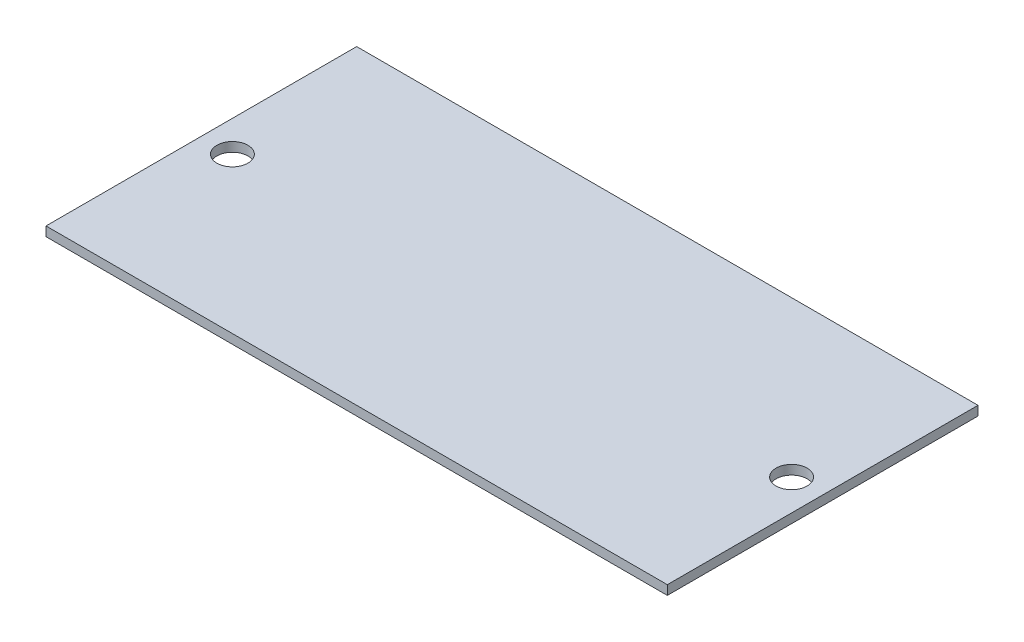
ISO-10303-21;
HEADER;
FILE_DESCRIPTION(('STEP AP214'),'2;1');
FILE_NAME('part.step','',(''),(''),'','','');
FILE_SCHEMA(('AUTOMOTIVE_DESIGN { 1 0 10303 214 1 1 1 1 }'));
ENDSEC;
DATA;
#1=APPLICATION_CONTEXT('core data for automotive mechanical design processes');
#2=APPLICATION_PROTOCOL_DEFINITION('international standard','automotive_design',2000,#1);
#3=PRODUCT_CONTEXT('',#1,'mechanical');
#4=PRODUCT('Part','Part','',(#3));
#5=PRODUCT_RELATED_PRODUCT_CATEGORY('part','',(#4));
#6=PRODUCT_DEFINITION_FORMATION('','',#4);
#7=PRODUCT_DEFINITION_CONTEXT('part definition',#1,'design');
#8=PRODUCT_DEFINITION('design','',#6,#7);
#9=PRODUCT_DEFINITION_SHAPE('','',#8);
#10=(LENGTH_UNIT() NAMED_UNIT(*) SI_UNIT(.MILLI.,.METRE.));
#11=(NAMED_UNIT(*) PLANE_ANGLE_UNIT() SI_UNIT($,.RADIAN.));
#12=(NAMED_UNIT(*) SI_UNIT($,.STERADIAN.) SOLID_ANGLE_UNIT());
#13=UNCERTAINTY_MEASURE_WITH_UNIT(LENGTH_MEASURE(1.E-05),#10,'distance_accuracy_value','');
#14=(GEOMETRIC_REPRESENTATION_CONTEXT(3) GLOBAL_UNCERTAINTY_ASSIGNED_CONTEXT((#13)) GLOBAL_UNIT_ASSIGNED_CONTEXT((#10,
#11,#12)) REPRESENTATION_CONTEXT('',''));
#15=CARTESIAN_POINT('',(0.,0.,0.));
#16=DIRECTION('',(0.,0.,1.));
#17=DIRECTION('',(1.,0.,0.));
#18=AXIS2_PLACEMENT_3D('',#15,#16,#17);
#19=CARTESIAN_POINT('',(-52.0365754200129,1.5,-35.913665889487));
#20=DIRECTION('',(1.,0.,0.));
#21=DIRECTION('',(0.,0.,-1.));
#22=AXIS2_PLACEMENT_3D('',#19,#20,#21);
#23=PLANE('',#22);
#24=DIRECTION('',(0.,0.,1.));
#25=VECTOR('',#24,1.);
#26=CARTESIAN_POINT('',(-52.0365754200129,0.,-35.913665889487));
#27=LINE('',#26,#25);
#28=CARTESIAN_POINT('',(-52.0365754200129,0.,-35.913665889487));
#29=VERTEX_POINT('',#28);
#30=CARTESIAN_POINT('',(-52.0365754200128,0.,14.086334110513));
#31=VERTEX_POINT('',#30);
#32=EDGE_CURVE('E109',#29,#31,#27,.T.);
#33=ORIENTED_EDGE('',*,*,#32,.T.);
#34=DIRECTION('',(0.,-1.,0.));
#35=VECTOR('',#34,1.);
#36=CARTESIAN_POINT('',(-52.0365754200128,1.5,14.086334110513));
#37=LINE('',#36,#35);
#38=CARTESIAN_POINT('',(-52.0365754200128,1.5,14.086334110513));
#39=VERTEX_POINT('',#38);
#40=EDGE_CURVE('E11',#39,#31,#37,.T.);
#41=ORIENTED_EDGE('',*,*,#40,.F.);
#42=DIRECTION('',(0.,0.,1.));
#43=VECTOR('',#42,1.);
#44=CARTESIAN_POINT('',(-52.0365754200129,1.5,-35.913665889487));
#45=LINE('',#44,#43);
#46=CARTESIAN_POINT('',(-52.0365754200129,1.5,-35.913665889487));
#47=VERTEX_POINT('',#46);
#48=EDGE_CURVE('E91',#47,#39,#45,.T.);
#49=ORIENTED_EDGE('',*,*,#48,.F.);
#50=DIRECTION('',(0.,-1.,0.));
#51=VECTOR('',#50,1.);
#52=CARTESIAN_POINT('',(-52.0365754200129,1.5,-35.913665889487));
#53=LINE('',#52,#51);
#54=EDGE_CURVE('E58',#47,#29,#53,.T.);
#55=ORIENTED_EDGE('',*,*,#54,.T.);
#56=EDGE_LOOP('',(#33,#41,#49,#55));
#57=FACE_BOUND('',#56,.T.);
#58=ADVANCED_FACE('F41',(#57),#23,.F.);
#59=CARTESIAN_POINT('',(-52.0365754200128,1.5,14.086334110513));
#60=DIRECTION('',(0.,0.,-1.));
#61=DIRECTION('',(-1.,0.,0.));
#62=AXIS2_PLACEMENT_3D('',#59,#60,#61);
#63=PLANE('',#62);
#64=DIRECTION('',(1.,0.,0.));
#65=VECTOR('',#64,1.);
#66=CARTESIAN_POINT('',(-52.0365754200128,0.,14.086334110513));
#67=LINE('',#66,#65);
#68=CARTESIAN_POINT('',(47.9634245799872,0.,14.086334110513));
#69=VERTEX_POINT('',#68);
#70=EDGE_CURVE('E97',#31,#69,#67,.T.);
#71=ORIENTED_EDGE('',*,*,#70,.T.);
#72=DIRECTION('',(0.,-1.,0.));
#73=VECTOR('',#72,1.);
#74=CARTESIAN_POINT('',(47.9634245799872,1.5,14.086334110513));
#75=LINE('',#74,#73);
#76=CARTESIAN_POINT('',(47.9634245799872,1.5,14.086334110513));
#77=VERTEX_POINT('',#76);
#78=EDGE_CURVE('E50',#77,#69,#75,.T.);
#79=ORIENTED_EDGE('',*,*,#78,.F.);
#80=DIRECTION('',(1.,0.,0.));
#81=VECTOR('',#80,1.);
#82=CARTESIAN_POINT('',(-52.0365754200128,1.5,14.086334110513));
#83=LINE('',#82,#81);
#84=EDGE_CURVE('E83',#39,#77,#83,.T.);
#85=ORIENTED_EDGE('',*,*,#84,.F.);
#86=ORIENTED_EDGE('',*,*,#40,.T.);
#87=EDGE_LOOP('',(#71,#79,#85,#86));
#88=FACE_BOUND('',#87,.T.);
#89=ADVANCED_FACE('F96',(#88),#63,.F.);
#90=CARTESIAN_POINT('',(47.9634245799872,1.5,-35.913665889487));
#91=DIRECTION('',(1.,0.,0.));
#92=DIRECTION('',(0.,0.,-1.));
#93=AXIS2_PLACEMENT_3D('',#90,#91,#92);
#94=PLANE('',#93);
#95=DIRECTION('',(0.,0.,1.));
#96=VECTOR('',#95,1.);
#97=CARTESIAN_POINT('',(47.9634245799872,0.,-35.913665889487));
#98=LINE('',#97,#96);
#99=CARTESIAN_POINT('',(47.9634245799872,0.,-35.913665889487));
#100=VERTEX_POINT('',#99);
#101=EDGE_CURVE('E115',#100,#69,#98,.T.);
#102=ORIENTED_EDGE('',*,*,#101,.F.);
#103=DIRECTION('',(0.,-1.,0.));
#104=VECTOR('',#103,1.);
#105=CARTESIAN_POINT('',(47.9634245799872,1.5,-35.913665889487));
#106=LINE('',#105,#104);
#107=CARTESIAN_POINT('',(47.9634245799872,1.5,-35.913665889487));
#108=VERTEX_POINT('',#107);
#109=EDGE_CURVE('E72',#108,#100,#106,.T.);
#110=ORIENTED_EDGE('',*,*,#109,.F.);
#111=DIRECTION('',(0.,0.,1.));
#112=VECTOR('',#111,1.);
#113=CARTESIAN_POINT('',(47.9634245799872,1.5,-35.913665889487));
#114=LINE('',#113,#112);
#115=EDGE_CURVE('E90',#108,#77,#114,.T.);
#116=ORIENTED_EDGE('',*,*,#115,.T.);
#117=ORIENTED_EDGE('',*,*,#78,.T.);
#118=EDGE_LOOP('',(#102,#110,#116,#117));
#119=FACE_BOUND('',#118,.T.);
#120=ADVANCED_FACE('F101',(#119),#94,.T.);
#121=CARTESIAN_POINT('',(-52.0365754200129,1.5,-35.913665889487));
#122=DIRECTION('',(0.,0.,-1.));
#123=DIRECTION('',(-1.,0.,0.));
#124=AXIS2_PLACEMENT_3D('',#121,#122,#123);
#125=PLANE('',#124);
#126=DIRECTION('',(1.,0.,0.));
#127=VECTOR('',#126,1.);
#128=CARTESIAN_POINT('',(-52.0365754200129,0.,-35.913665889487));
#129=LINE('',#128,#127);
#130=EDGE_CURVE('E118',#29,#100,#129,.T.);
#131=ORIENTED_EDGE('',*,*,#130,.F.);
#132=ORIENTED_EDGE('',*,*,#54,.F.);
#133=DIRECTION('',(1.,0.,0.));
#134=VECTOR('',#133,1.);
#135=CARTESIAN_POINT('',(-52.0365754200129,1.5,-35.913665889487));
#136=LINE('',#135,#134);
#137=EDGE_CURVE('E103',#47,#108,#136,.T.);
#138=ORIENTED_EDGE('',*,*,#137,.T.);
#139=ORIENTED_EDGE('',*,*,#109,.T.);
#140=EDGE_LOOP('',(#131,#132,#138,#139));
#141=FACE_BOUND('',#140,.T.);
#142=ADVANCED_FACE('F158',(#141),#125,.T.);
#143=CARTESIAN_POINT('',(0.,1.5,0.));
#144=DIRECTION('',(0.,1.,0.));
#145=DIRECTION('',(0.,0.,1.));
#146=AXIS2_PLACEMENT_3D('',#143,#144,#145);
#147=PLANE('',#146);
#148=CARTESIAN_POINT('',(-47.0365754200129,1.5,-10.913665889487));
#149=DIRECTION('',(0.,-1.,0.));
#150=DIRECTION('',(0.,0.,-1.));
#151=AXIS2_PLACEMENT_3D('',#148,#149,#150);
#152=CIRCLE('',#151,2.5);
#153=CARTESIAN_POINT('',(-47.0365754200129,1.5,-13.413665889487));
#154=VERTEX_POINT('',#153);
#155=EDGE_CURVE('E112',#154,#154,#152,.T.);
#156=ORIENTED_EDGE('',*,*,#155,.T.);
#157=EDGE_LOOP('',(#156));
#158=FACE_BOUND('',#157,.T.);
#159=CARTESIAN_POINT('',(42.9634245799872,1.5,-10.913665889487));
#160=DIRECTION('',(0.,-1.,0.));
#161=DIRECTION('',(0.,0.,-1.));
#162=AXIS2_PLACEMENT_3D('',#159,#160,#161);
#163=CIRCLE('',#162,2.5);
#164=CARTESIAN_POINT('',(42.9634245799872,1.5,-13.413665889487));
#165=VERTEX_POINT('',#164);
#166=EDGE_CURVE('E132',#165,#165,#163,.T.);
#167=ORIENTED_EDGE('',*,*,#166,.T.);
#168=EDGE_LOOP('',(#167));
#169=FACE_BOUND('',#168,.T.);
#170=ORIENTED_EDGE('',*,*,#48,.T.);
#171=ORIENTED_EDGE('',*,*,#84,.T.);
#172=ORIENTED_EDGE('',*,*,#115,.F.);
#173=ORIENTED_EDGE('',*,*,#137,.F.);
#174=EDGE_LOOP('',(#170,#171,#172,#173));
#175=FACE_BOUND('',#174,.T.);
#176=ADVANCED_FACE('F87',(#158,#169,#175),#147,.T.);
#177=CARTESIAN_POINT('',(0.,0.,0.));
#178=DIRECTION('',(0.,1.,0.));
#179=DIRECTION('',(0.,0.,1.));
#180=AXIS2_PLACEMENT_3D('',#177,#178,#179);
#181=PLANE('',#180);
#182=CARTESIAN_POINT('',(-47.0365754200129,0.,-10.913665889487));
#183=DIRECTION('',(0.,-1.,0.));
#184=DIRECTION('',(0.,0.,-1.));
#185=AXIS2_PLACEMENT_3D('',#182,#183,#184);
#186=CIRCLE('',#185,2.5);
#187=CARTESIAN_POINT('',(-47.0365754200129,0.,-13.413665889487));
#188=VERTEX_POINT('',#187);
#189=EDGE_CURVE('E136',#188,#188,#186,.T.);
#190=ORIENTED_EDGE('',*,*,#189,.F.);
#191=EDGE_LOOP('',(#190));
#192=FACE_BOUND('',#191,.T.);
#193=CARTESIAN_POINT('',(42.9634245799872,0.,-10.913665889487));
#194=DIRECTION('',(0.,-1.,0.));
#195=DIRECTION('',(0.,0.,-1.));
#196=AXIS2_PLACEMENT_3D('',#193,#194,#195);
#197=CIRCLE('',#196,2.5);
#198=CARTESIAN_POINT('',(42.9634245799872,0.,-13.413665889487));
#199=VERTEX_POINT('',#198);
#200=EDGE_CURVE('E128',#199,#199,#197,.T.);
#201=ORIENTED_EDGE('',*,*,#200,.F.);
#202=EDGE_LOOP('',(#201));
#203=FACE_BOUND('',#202,.T.);
#204=ORIENTED_EDGE('',*,*,#32,.F.);
#205=ORIENTED_EDGE('',*,*,#130,.T.);
#206=ORIENTED_EDGE('',*,*,#101,.T.);
#207=ORIENTED_EDGE('',*,*,#70,.F.);
#208=EDGE_LOOP('',(#204,#205,#206,#207));
#209=FACE_BOUND('',#208,.T.);
#210=ADVANCED_FACE('F153',(#192,#203,#209),#181,.F.);
#211=CARTESIAN_POINT('',(42.9634245799872,1.5,-10.913665889487));
#212=DIRECTION('',(0.,-1.,0.));
#213=DIRECTION('',(0.,0.,-1.));
#214=AXIS2_PLACEMENT_3D('',#211,#212,#213);
#215=CYLINDRICAL_SURFACE('',#214,2.5);
#216=ORIENTED_EDGE('',*,*,#166,.F.);
#217=EDGE_LOOP('',(#216));
#218=FACE_BOUND('',#217,.T.);
#219=ORIENTED_EDGE('',*,*,#200,.T.);
#220=EDGE_LOOP('',(#219));
#221=FACE_BOUND('',#220,.T.);
#222=ADVANCED_FACE('F149',(#218,#221),#215,.F.);
#223=CARTESIAN_POINT('',(-47.0365754200129,1.5,-10.913665889487));
#224=DIRECTION('',(0.,-1.,0.));
#225=DIRECTION('',(0.,0.,-1.));
#226=AXIS2_PLACEMENT_3D('',#223,#224,#225);
#227=CYLINDRICAL_SURFACE('',#226,2.5);
#228=ORIENTED_EDGE('',*,*,#155,.F.);
#229=EDGE_LOOP('',(#228));
#230=FACE_BOUND('',#229,.T.);
#231=ORIENTED_EDGE('',*,*,#189,.T.);
#232=EDGE_LOOP('',(#231));
#233=FACE_BOUND('',#232,.T.);
#234=ADVANCED_FACE('F146',(#230,#233),#227,.F.);
#235=CLOSED_SHELL('',(#58,#89,#120,#142,#176,#210,#222,#234));
#236=MANIFOLD_SOLID_BREP('B2',#235);
#237=ADVANCED_BREP_SHAPE_REPRESENTATION('',(#18,#236),#14);
#238=SHAPE_DEFINITION_REPRESENTATION(#9,#237);
ENDSEC;
END-ISO-10303-21;
